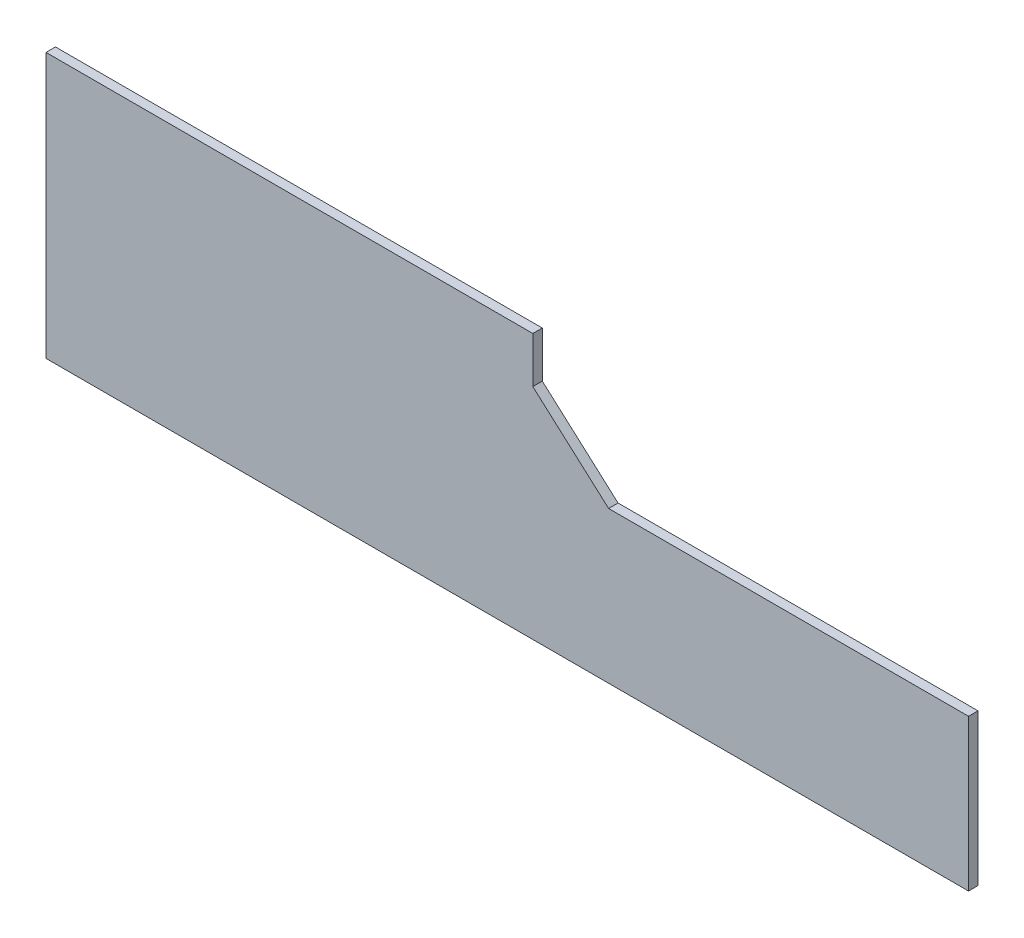
ISO-10303-21;
HEADER;
FILE_DESCRIPTION(('STEP AP214'),'2;1');
FILE_NAME('part.step','',(''),(''),'','','');
FILE_SCHEMA(('AUTOMOTIVE_DESIGN { 1 0 10303 214 1 1 1 1 }'));
ENDSEC;
DATA;
#1=APPLICATION_CONTEXT('core data for automotive mechanical design processes');
#2=APPLICATION_PROTOCOL_DEFINITION('international standard','automotive_design',2000,#1);
#3=PRODUCT_CONTEXT('',#1,'mechanical');
#4=PRODUCT('Part','Part','',(#3));
#5=PRODUCT_RELATED_PRODUCT_CATEGORY('part','',(#4));
#6=PRODUCT_DEFINITION_FORMATION('','',#4);
#7=PRODUCT_DEFINITION_CONTEXT('part definition',#1,'design');
#8=PRODUCT_DEFINITION('design','',#6,#7);
#9=PRODUCT_DEFINITION_SHAPE('','',#8);
#10=(LENGTH_UNIT() NAMED_UNIT(*) SI_UNIT(.MILLI.,.METRE.));
#11=(NAMED_UNIT(*) PLANE_ANGLE_UNIT() SI_UNIT($,.RADIAN.));
#12=(NAMED_UNIT(*) SI_UNIT($,.STERADIAN.) SOLID_ANGLE_UNIT());
#13=UNCERTAINTY_MEASURE_WITH_UNIT(LENGTH_MEASURE(1.E-05),#10,'distance_accuracy_value','');
#14=(GEOMETRIC_REPRESENTATION_CONTEXT(3) GLOBAL_UNCERTAINTY_ASSIGNED_CONTEXT((#13)) GLOBAL_UNIT_ASSIGNED_CONTEXT((#10,
#11,#12)) REPRESENTATION_CONTEXT('',''));
#15=CARTESIAN_POINT('',(0.,0.,0.));
#16=DIRECTION('',(0.,0.,1.));
#17=DIRECTION('',(1.,0.,0.));
#18=AXIS2_PLACEMENT_3D('',#15,#16,#17);
#19=CARTESIAN_POINT('',(-154.615,44.420500059,3.175));
#20=DIRECTION('',(0.,-1.,0.));
#21=DIRECTION('',(-1.,0.,0.));
#22=AXIS2_PLACEMENT_3D('',#19,#20,#21);
#23=PLANE('',#22);
#24=DIRECTION('',(0.,0.,1.));
#25=VECTOR('',#24,1.);
#26=CARTESIAN_POINT('',(8.56500000000002,44.420500059,3.175));
#27=LINE('',#26,#25);
#28=CARTESIAN_POINT('',(8.56500000000002,44.420500059,0.));
#29=VERTEX_POINT('',#28);
#30=CARTESIAN_POINT('',(8.56500000000002,44.420500059,3.175));
#31=VERTEX_POINT('',#30);
#32=EDGE_CURVE('E11',#29,#31,#27,.T.);
#33=ORIENTED_EDGE('',*,*,#32,.F.);
#34=DIRECTION('',(-1.,0.,0.));
#35=VECTOR('',#34,1.);
#36=CARTESIAN_POINT('',(0.,44.420500059,0.));
#37=LINE('',#36,#35);
#38=CARTESIAN_POINT('',(-154.615,44.420500059,0.));
#39=VERTEX_POINT('',#38);
#40=EDGE_CURVE('E107',#29,#39,#37,.T.);
#41=ORIENTED_EDGE('',*,*,#40,.T.);
#42=DIRECTION('',(0.,0.,1.));
#43=VECTOR('',#42,1.);
#44=CARTESIAN_POINT('',(-154.615,44.420500059,3.175));
#45=LINE('',#44,#43);
#46=CARTESIAN_POINT('',(-154.615,44.420500059,3.175));
#47=VERTEX_POINT('',#46);
#48=EDGE_CURVE('E53',#39,#47,#45,.T.);
#49=ORIENTED_EDGE('',*,*,#48,.T.);
#50=DIRECTION('',(-1.,0.,0.));
#51=VECTOR('',#50,1.);
#52=CARTESIAN_POINT('',(-154.615,44.420500059,3.175));
#53=LINE('',#52,#51);
#54=EDGE_CURVE('E140',#31,#47,#53,.T.);
#55=ORIENTED_EDGE('',*,*,#54,.F.);
#56=EDGE_LOOP('',(#33,#41,#49,#55));
#57=FACE_BOUND('',#56,.T.);
#58=ADVANCED_FACE('F43',(#57),#23,.F.);
#59=CARTESIAN_POINT('',(-154.615,-44.420500059,3.175));
#60=DIRECTION('',(1.,0.,0.));
#61=DIRECTION('',(0.,-1.,0.));
#62=AXIS2_PLACEMENT_3D('',#59,#60,#61);
#63=PLANE('',#62);
#64=ORIENTED_EDGE('',*,*,#48,.F.);
#65=DIRECTION('',(0.,1.,0.));
#66=VECTOR('',#65,1.);
#67=CARTESIAN_POINT('',(-154.615,0.,0.));
#68=LINE('',#67,#66);
#69=CARTESIAN_POINT('',(-154.615,-44.420500059,0.));
#70=VERTEX_POINT('',#69);
#71=EDGE_CURVE('E123',#39,#70,#68,.F.);
#72=ORIENTED_EDGE('',*,*,#71,.T.);
#73=DIRECTION('',(0.,0.,1.));
#74=VECTOR('',#73,1.);
#75=CARTESIAN_POINT('',(-154.615,-44.420500059,3.175));
#76=LINE('',#75,#74);
#77=CARTESIAN_POINT('',(-154.615,-44.420500059,3.175));
#78=VERTEX_POINT('',#77);
#79=EDGE_CURVE('E133',#70,#78,#76,.T.);
#80=ORIENTED_EDGE('',*,*,#79,.T.);
#81=DIRECTION('',(0.,-1.,0.));
#82=VECTOR('',#81,1.);
#83=CARTESIAN_POINT('',(-154.615,-44.420500059,3.175));
#84=LINE('',#83,#82);
#85=EDGE_CURVE('E149',#47,#78,#84,.T.);
#86=ORIENTED_EDGE('',*,*,#85,.F.);
#87=EDGE_LOOP('',(#64,#72,#80,#86));
#88=FACE_BOUND('',#87,.T.);
#89=ADVANCED_FACE('F152',(#88),#63,.F.);
#90=CARTESIAN_POINT('',(-154.615,-44.420500059,3.175));
#91=DIRECTION('',(0.,1.,0.));
#92=DIRECTION('',(1.,0.,0.));
#93=AXIS2_PLACEMENT_3D('',#90,#91,#92);
#94=PLANE('',#93);
#95=ORIENTED_EDGE('',*,*,#79,.F.);
#96=DIRECTION('',(-1.,0.,0.));
#97=VECTOR('',#96,1.);
#98=CARTESIAN_POINT('',(0.,-44.420500059,0.));
#99=LINE('',#98,#97);
#100=CARTESIAN_POINT('',(154.615,-44.420500059,0.));
#101=VERTEX_POINT('',#100);
#102=EDGE_CURVE('E120',#70,#101,#99,.F.);
#103=ORIENTED_EDGE('',*,*,#102,.T.);
#104=DIRECTION('',(0.,0.,1.));
#105=VECTOR('',#104,1.);
#106=CARTESIAN_POINT('',(154.615,-44.420500059,3.175));
#107=LINE('',#106,#105);
#108=CARTESIAN_POINT('',(154.615,-44.420500059,3.175));
#109=VERTEX_POINT('',#108);
#110=EDGE_CURVE('E130',#101,#109,#107,.T.);
#111=ORIENTED_EDGE('',*,*,#110,.T.);
#112=DIRECTION('',(1.,0.,0.));
#113=VECTOR('',#112,1.);
#114=CARTESIAN_POINT('',(-154.615,-44.420500059,3.175));
#115=LINE('',#114,#113);
#116=EDGE_CURVE('E153',#78,#109,#115,.T.);
#117=ORIENTED_EDGE('',*,*,#116,.F.);
#118=EDGE_LOOP('',(#95,#103,#111,#117));
#119=FACE_BOUND('',#118,.T.);
#120=ADVANCED_FACE('F167',(#119),#94,.F.);
#121=CARTESIAN_POINT('',(154.615,-44.420500059,3.175));
#122=DIRECTION('',(-1.,0.,0.));
#123=DIRECTION('',(0.,1.,0.));
#124=AXIS2_PLACEMENT_3D('',#121,#122,#123);
#125=PLANE('',#124);
#126=ORIENTED_EDGE('',*,*,#110,.F.);
#127=DIRECTION('',(0.,1.,0.));
#128=VECTOR('',#127,1.);
#129=CARTESIAN_POINT('',(154.615,0.,0.));
#130=LINE('',#129,#128);
#131=CARTESIAN_POINT('',(154.615,6.32050005899998,0.));
#132=VERTEX_POINT('',#131);
#133=EDGE_CURVE('E117',#101,#132,#130,.T.);
#134=ORIENTED_EDGE('',*,*,#133,.T.);
#135=DIRECTION('',(0.,0.,1.));
#136=VECTOR('',#135,1.);
#137=CARTESIAN_POINT('',(154.615,6.32050005899998,3.175));
#138=LINE('',#137,#136);
#139=CARTESIAN_POINT('',(154.615,6.32050005899998,3.175));
#140=VERTEX_POINT('',#139);
#141=EDGE_CURVE('E128',#132,#140,#138,.T.);
#142=ORIENTED_EDGE('',*,*,#141,.T.);
#143=DIRECTION('',(0.,1.,0.));
#144=VECTOR('',#143,1.);
#145=CARTESIAN_POINT('',(154.615,-44.420500059,3.175));
#146=LINE('',#145,#144);
#147=EDGE_CURVE('E155',#109,#140,#146,.T.);
#148=ORIENTED_EDGE('',*,*,#147,.F.);
#149=EDGE_LOOP('',(#126,#134,#142,#148));
#150=FACE_BOUND('',#149,.T.);
#151=ADVANCED_FACE('F164',(#150),#125,.F.);
#152=CARTESIAN_POINT('',(0.,6.32050005899997,3.175));
#153=DIRECTION('',(0.,-1.,0.));
#154=DIRECTION('',(-1.,0.,0.));
#155=AXIS2_PLACEMENT_3D('',#152,#153,#154);
#156=PLANE('',#155);
#157=ORIENTED_EDGE('',*,*,#141,.F.);
#158=DIRECTION('',(-1.,0.,0.));
#159=VECTOR('',#158,1.);
#160=CARTESIAN_POINT('',(0.,6.32050005899998,0.));
#161=LINE('',#160,#159);
#162=CARTESIAN_POINT('',(33.965,6.32050005899998,0.));
#163=VERTEX_POINT('',#162);
#164=EDGE_CURVE('E114',#132,#163,#161,.T.);
#165=ORIENTED_EDGE('',*,*,#164,.T.);
#166=DIRECTION('',(0.,0.,1.));
#167=VECTOR('',#166,1.);
#168=CARTESIAN_POINT('',(33.965,6.32050005899998,3.175));
#169=LINE('',#168,#167);
#170=CARTESIAN_POINT('',(33.965,6.32050005899998,3.175));
#171=VERTEX_POINT('',#170);
#172=EDGE_CURVE('E61',#163,#171,#169,.T.);
#173=ORIENTED_EDGE('',*,*,#172,.T.);
#174=DIRECTION('',(-1.,0.,0.));
#175=VECTOR('',#174,1.);
#176=CARTESIAN_POINT('',(0.,6.32050005899997,3.175));
#177=LINE('',#176,#175);
#178=EDGE_CURVE('E100',#140,#171,#177,.T.);
#179=ORIENTED_EDGE('',*,*,#178,.F.);
#180=EDGE_LOOP('',(#157,#165,#173,#179));
#181=FACE_BOUND('',#180,.T.);
#182=ADVANCED_FACE('F161',(#181),#156,.F.);
#183=CARTESIAN_POINT('',(18.2073442232836,20.3908113415305,3.175));
#184=DIRECTION('',(0.666041469854868,0.745914713914109,0.));
#185=DIRECTION('',(0.745914713914109,-0.666041469854868,0.));
#186=AXIS2_PLACEMENT_3D('',#183,#184,#185);
#187=PLANE('',#186);
#188=ORIENTED_EDGE('',*,*,#172,.F.);
#189=DIRECTION('',(0.745914713914109,-0.666041469854868,0.));
#190=VECTOR('',#189,1.);
#191=CARTESIAN_POINT('',(18.2073442232836,20.3908113415305,0.));
#192=LINE('',#191,#190);
#193=CARTESIAN_POINT('',(8.56500000000002,29.0006443419048,0.));
#194=VERTEX_POINT('',#193);
#195=EDGE_CURVE('E105',#194,#163,#192,.T.);
#196=ORIENTED_EDGE('',*,*,#195,.F.);
#197=DIRECTION('',(0.,0.,1.));
#198=VECTOR('',#197,1.);
#199=CARTESIAN_POINT('',(8.56500000000002,29.0006443419048,3.175));
#200=LINE('',#199,#198);
#201=CARTESIAN_POINT('',(8.56500000000002,29.0006443419048,3.175));
#202=VERTEX_POINT('',#201);
#203=EDGE_CURVE('E47',#194,#202,#200,.T.);
#204=ORIENTED_EDGE('',*,*,#203,.T.);
#205=DIRECTION('',(0.745914713914109,-0.666041469854868,0.));
#206=VECTOR('',#205,1.);
#207=CARTESIAN_POINT('',(18.2073442232836,20.3908113415305,3.175));
#208=LINE('',#207,#206);
#209=EDGE_CURVE('E116',#202,#171,#208,.T.);
#210=ORIENTED_EDGE('',*,*,#209,.T.);
#211=EDGE_LOOP('',(#188,#196,#204,#210));
#212=FACE_BOUND('',#211,.T.);
#213=ADVANCED_FACE('F109',(#212),#187,.T.);
#214=CARTESIAN_POINT('',(8.56500000000002,0.,3.175));
#215=DIRECTION('',(1.,0.,0.));
#216=DIRECTION('',(0.,-1.,0.));
#217=AXIS2_PLACEMENT_3D('',#214,#215,#216);
#218=PLANE('',#217);
#219=DIRECTION('',(0.,1.,0.));
#220=VECTOR('',#219,1.);
#221=CARTESIAN_POINT('',(8.56500000000002,0.,0.));
#222=LINE('',#221,#220);
#223=EDGE_CURVE('E94',#29,#194,#222,.F.);
#224=ORIENTED_EDGE('',*,*,#223,.F.);
#225=ORIENTED_EDGE('',*,*,#32,.T.);
#226=DIRECTION('',(0.,-1.,0.));
#227=VECTOR('',#226,1.);
#228=CARTESIAN_POINT('',(8.56500000000002,0.,3.175));
#229=LINE('',#228,#227);
#230=EDGE_CURVE('E96',#31,#202,#229,.T.);
#231=ORIENTED_EDGE('',*,*,#230,.T.);
#232=ORIENTED_EDGE('',*,*,#203,.F.);
#233=EDGE_LOOP('',(#224,#225,#231,#232));
#234=FACE_BOUND('',#233,.T.);
#235=ADVANCED_FACE('F45',(#234),#218,.T.);
#236=CARTESIAN_POINT('',(0.,0.,3.175));
#237=DIRECTION('',(0.,0.,-1.));
#238=DIRECTION('',(-1.,0.,0.));
#239=AXIS2_PLACEMENT_3D('',#236,#237,#238);
#240=PLANE('',#239);
#241=ORIENTED_EDGE('',*,*,#209,.F.);
#242=ORIENTED_EDGE('',*,*,#230,.F.);
#243=ORIENTED_EDGE('',*,*,#54,.T.);
#244=ORIENTED_EDGE('',*,*,#85,.T.);
#245=ORIENTED_EDGE('',*,*,#116,.T.);
#246=ORIENTED_EDGE('',*,*,#147,.T.);
#247=ORIENTED_EDGE('',*,*,#178,.T.);
#248=EDGE_LOOP('',(#241,#242,#243,#244,#245,#246,#247));
#249=FACE_BOUND('',#248,.T.);
#250=ADVANCED_FACE('F147',(#249),#240,.F.);
#251=CARTESIAN_POINT('',(0.,0.,0.));
#252=DIRECTION('',(0.,0.,-1.));
#253=DIRECTION('',(-1.,0.,0.));
#254=AXIS2_PLACEMENT_3D('',#251,#252,#253);
#255=PLANE('',#254);
#256=ORIENTED_EDGE('',*,*,#195,.T.);
#257=ORIENTED_EDGE('',*,*,#164,.F.);
#258=ORIENTED_EDGE('',*,*,#133,.F.);
#259=ORIENTED_EDGE('',*,*,#102,.F.);
#260=ORIENTED_EDGE('',*,*,#71,.F.);
#261=ORIENTED_EDGE('',*,*,#40,.F.);
#262=ORIENTED_EDGE('',*,*,#223,.T.);
#263=EDGE_LOOP('',(#256,#257,#258,#259,#260,#261,#262));
#264=FACE_BOUND('',#263,.T.);
#265=ADVANCED_FACE('F103',(#264),#255,.T.);
#266=CLOSED_SHELL('',(#58,#89,#120,#151,#182,#213,#235,#250,#265));
#267=MANIFOLD_SOLID_BREP('B2',#266);
#268=ADVANCED_BREP_SHAPE_REPRESENTATION('',(#18,#267),#14);
#269=SHAPE_DEFINITION_REPRESENTATION(#9,#268);
ENDSEC;
END-ISO-10303-21;
